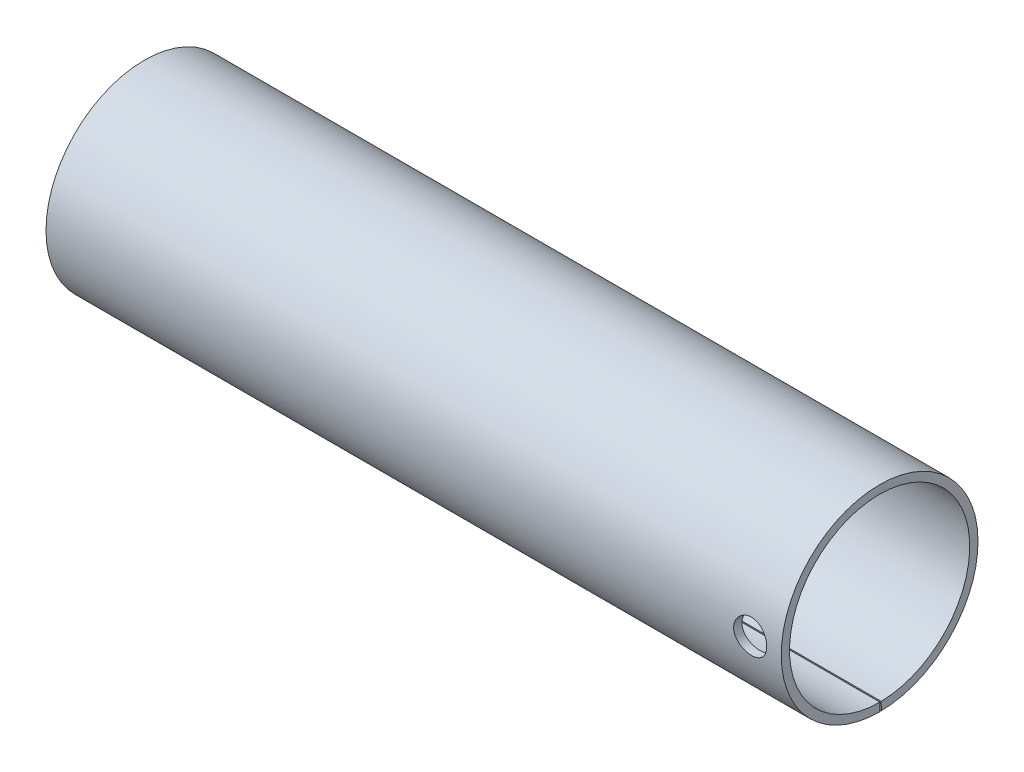
ISO-10303-21;
HEADER;
FILE_DESCRIPTION(('STEP AP214'),'2;1');
FILE_NAME('part.step','',(''),(''),'','','');
FILE_SCHEMA(('AUTOMOTIVE_DESIGN { 1 0 10303 214 1 1 1 1 }'));
ENDSEC;
DATA;
#1=APPLICATION_CONTEXT('core data for automotive mechanical design processes');
#2=APPLICATION_PROTOCOL_DEFINITION('international standard','automotive_design',2000,#1);
#3=PRODUCT_CONTEXT('',#1,'mechanical');
#4=PRODUCT('Part','Part','',(#3));
#5=PRODUCT_RELATED_PRODUCT_CATEGORY('part','',(#4));
#6=PRODUCT_DEFINITION_FORMATION('','',#4);
#7=PRODUCT_DEFINITION_CONTEXT('part definition',#1,'design');
#8=PRODUCT_DEFINITION('design','',#6,#7);
#9=PRODUCT_DEFINITION_SHAPE('','',#8);
#10=(LENGTH_UNIT() NAMED_UNIT(*) SI_UNIT(.MILLI.,.METRE.));
#11=(NAMED_UNIT(*) PLANE_ANGLE_UNIT() SI_UNIT($,.RADIAN.));
#12=(NAMED_UNIT(*) SI_UNIT($,.STERADIAN.) SOLID_ANGLE_UNIT());
#13=UNCERTAINTY_MEASURE_WITH_UNIT(LENGTH_MEASURE(1.E-05),#10,'distance_accuracy_value','');
#14=(GEOMETRIC_REPRESENTATION_CONTEXT(3) GLOBAL_UNCERTAINTY_ASSIGNED_CONTEXT((#13)) GLOBAL_UNIT_ASSIGNED_CONTEXT((#10,
#11,#12)) REPRESENTATION_CONTEXT('',''));
#15=CARTESIAN_POINT('',(0.,0.,0.));
#16=DIRECTION('',(0.,0.,1.));
#17=DIRECTION('',(1.,0.,0.));
#18=AXIS2_PLACEMENT_3D('',#15,#16,#17);
#19=CARTESIAN_POINT('',(175.5,117.75,-118.000000000001));
#20=DIRECTION('',(-1.,0.,0.));
#21=DIRECTION('',(0.,0.,-1.));
#22=AXIS2_PLACEMENT_3D('',#19,#20,#21);
#23=PLANE('',#22);
#24=DIRECTION('',(0.,1.,0.));
#25=VECTOR('',#24,1.);
#26=CARTESIAN_POINT('',(175.5,117.75,-118.100000000001));
#27=LINE('',#26,#25);
#28=CARTESIAN_POINT('',(175.5,115.75,-118.100000000001));
#29=VERTEX_POINT('',#28);
#30=CARTESIAN_POINT('',(175.5,117.75,-118.100000000001));
#31=VERTEX_POINT('',#30);
#32=EDGE_CURVE('E14',#29,#31,#27,.T.);
#33=ORIENTED_EDGE('',*,*,#32,.F.);
#34=DIRECTION('',(0.,0.,1.));
#35=VECTOR('',#34,1.);
#36=CARTESIAN_POINT('',(175.5,115.75,-118.000000000001));
#37=LINE('',#36,#35);
#38=CARTESIAN_POINT('',(175.5,115.75,-118.000000000001));
#39=VERTEX_POINT('',#38);
#40=EDGE_CURVE('E239',#39,#29,#37,.F.);
#41=ORIENTED_EDGE('',*,*,#40,.F.);
#42=DIRECTION('',(0.,1.,0.));
#43=VECTOR('',#42,1.);
#44=CARTESIAN_POINT('',(175.5,117.75,-118.000000000001));
#45=LINE('',#44,#43);
#46=CARTESIAN_POINT('',(175.5,117.75,-118.000000000001));
#47=VERTEX_POINT('',#46);
#48=EDGE_CURVE('E145',#39,#47,#45,.T.);
#49=ORIENTED_EDGE('',*,*,#48,.T.);
#50=DIRECTION('',(0.,0.,-1.));
#51=VECTOR('',#50,1.);
#52=CARTESIAN_POINT('',(175.5,117.75,-118.000000000001));
#53=LINE('',#52,#51);
#54=EDGE_CURVE('E230',#47,#31,#53,.T.);
#55=ORIENTED_EDGE('',*,*,#54,.T.);
#56=EDGE_LOOP('',(#33,#41,#49,#55));
#57=FACE_BOUND('',#56,.T.);
#58=ADVANCED_FACE('F135',(#57),#23,.T.);
#59=CARTESIAN_POINT('',(353.,117.75,-118.000000000001));
#60=DIRECTION('',(-1.,0.,0.));
#61=DIRECTION('',(0.,0.,-1.));
#62=AXIS2_PLACEMENT_3D('',#59,#60,#61);
#63=PLANE('',#62);
#64=DIRECTION('',(0.,1.,0.));
#65=VECTOR('',#64,1.);
#66=CARTESIAN_POINT('',(353.,117.75,-118.000000000001));
#67=LINE('',#66,#65);
#68=CARTESIAN_POINT('',(353.,115.75,-118.000000000001));
#69=VERTEX_POINT('',#68);
#70=CARTESIAN_POINT('',(353.,117.75,-118.000000000001));
#71=VERTEX_POINT('',#70);
#72=EDGE_CURVE('E216',#69,#71,#67,.T.);
#73=ORIENTED_EDGE('',*,*,#72,.F.);
#74=DIRECTION('',(0.,0.,1.));
#75=VECTOR('',#74,1.);
#76=CARTESIAN_POINT('',(353.,115.75,-118.000000000001));
#77=LINE('',#76,#75);
#78=CARTESIAN_POINT('',(353.,115.75,-118.100000000001));
#79=VERTEX_POINT('',#78);
#80=EDGE_CURVE('E207',#69,#79,#77,.F.);
#81=ORIENTED_EDGE('',*,*,#80,.T.);
#82=DIRECTION('',(0.,1.,0.));
#83=VECTOR('',#82,1.);
#84=CARTESIAN_POINT('',(353.,117.75,-118.100000000001));
#85=LINE('',#84,#83);
#86=CARTESIAN_POINT('',(353.,117.75,-118.100000000001));
#87=VERTEX_POINT('',#86);
#88=EDGE_CURVE('E139',#79,#87,#85,.T.);
#89=ORIENTED_EDGE('',*,*,#88,.T.);
#90=DIRECTION('',(0.,0.,-1.));
#91=VECTOR('',#90,1.);
#92=CARTESIAN_POINT('',(353.,117.75,-118.000000000001));
#93=LINE('',#92,#91);
#94=EDGE_CURVE('E224',#71,#87,#93,.T.);
#95=ORIENTED_EDGE('',*,*,#94,.F.);
#96=EDGE_LOOP('',(#73,#81,#89,#95));
#97=FACE_BOUND('',#96,.T.);
#98=ADVANCED_FACE('F252',(#97),#63,.F.);
#99=CARTESIAN_POINT('',(175.5,117.75,-118.100000000001));
#100=DIRECTION('',(0.,0.,-1.));
#101=DIRECTION('',(1.,0.,0.));
#102=AXIS2_PLACEMENT_3D('',#99,#100,#101);
#103=PLANE('',#102);
#104=DIRECTION('',(1.,0.,0.));
#105=VECTOR('',#104,1.);
#106=CARTESIAN_POINT('',(175.5,115.75,-118.100000000001));
#107=LINE('',#106,#105);
#108=EDGE_CURVE('E237',#29,#79,#107,.T.);
#109=ORIENTED_EDGE('',*,*,#108,.F.);
#110=ORIENTED_EDGE('',*,*,#32,.T.);
#111=DIRECTION('',(1.,0.,0.));
#112=VECTOR('',#111,1.);
#113=CARTESIAN_POINT('',(175.5,117.75,-118.100000000001));
#114=LINE('',#113,#112);
#115=EDGE_CURVE('E227',#31,#87,#114,.T.);
#116=ORIENTED_EDGE('',*,*,#115,.T.);
#117=ORIENTED_EDGE('',*,*,#88,.F.);
#118=EDGE_LOOP('',(#109,#110,#116,#117));
#119=FACE_BOUND('',#118,.T.);
#120=ADVANCED_FACE('F137',(#119),#103,.T.);
#121=CARTESIAN_POINT('',(175.5,117.75,-118.000000000001));
#122=DIRECTION('',(0.,-1.,0.));
#123=DIRECTION('',(1.,0.,0.));
#124=AXIS2_PLACEMENT_3D('',#121,#122,#123);
#125=PLANE('',#124);
#126=ORIENTED_EDGE('',*,*,#94,.T.);
#127=ORIENTED_EDGE('',*,*,#115,.F.);
#128=ORIENTED_EDGE('',*,*,#54,.F.);
#129=DIRECTION('',(1.,0.,0.));
#130=VECTOR('',#129,1.);
#131=CARTESIAN_POINT('',(175.5,117.75,-118.000000000001));
#132=LINE('',#131,#130);
#133=EDGE_CURVE('E232',#47,#71,#132,.T.);
#134=ORIENTED_EDGE('',*,*,#133,.T.);
#135=EDGE_LOOP('',(#126,#127,#128,#134));
#136=FACE_BOUND('',#135,.T.);
#137=ADVANCED_FACE('F247',(#136),#125,.F.);
#138=CARTESIAN_POINT('',(175.5,115.75,-118.000000000001));
#139=DIRECTION('',(0.,-1.,0.));
#140=DIRECTION('',(1.,0.,0.));
#141=AXIS2_PLACEMENT_3D('',#138,#139,#140);
#142=PLANE('',#141);
#143=ORIENTED_EDGE('',*,*,#80,.F.);
#144=DIRECTION('',(1.,0.,0.));
#145=VECTOR('',#144,1.);
#146=CARTESIAN_POINT('',(175.5,115.75,-118.000000000001));
#147=LINE('',#146,#145);
#148=EDGE_CURVE('E228',#39,#69,#147,.T.);
#149=ORIENTED_EDGE('',*,*,#148,.F.);
#150=ORIENTED_EDGE('',*,*,#40,.T.);
#151=ORIENTED_EDGE('',*,*,#108,.T.);
#152=EDGE_LOOP('',(#143,#149,#150,#151));
#153=FACE_BOUND('',#152,.T.);
#154=ADVANCED_FACE('F250',(#153),#142,.T.);
#155=CARTESIAN_POINT('',(264.250000000001,117.753312630348,-118.379589840012));
#156=DIRECTION('',(0.,0.0174524064372695,-0.999847695156391));
#157=DIRECTION('',(1.,0.,0.));
#158=AXIS2_PLACEMENT_3D('',#155,#156,#157);
#159=PLANE('',#158);
#160=DIRECTION('',(0.,-0.999847695156391,-0.0174524064372695));
#161=VECTOR('',#160,1.);
#162=CARTESIAN_POINT('',(353.,117.753312630348,-118.379589840012));
#163=LINE('',#162,#161);
#164=CARTESIAN_POINT('',(353.,117.753312630348,-118.379589840012));
#165=VERTEX_POINT('',#164);
#166=CARTESIAN_POINT('',(353.,115.753617240036,-118.414494652887));
#167=VERTEX_POINT('',#166);
#168=EDGE_CURVE('E198',#165,#167,#163,.T.);
#169=ORIENTED_EDGE('',*,*,#168,.F.);
#170=DIRECTION('',(1.,0.,0.));
#171=VECTOR('',#170,1.);
#172=CARTESIAN_POINT('',(353.,117.753312630348,-118.379589840012));
#173=LINE('',#172,#171);
#174=CARTESIAN_POINT('',(175.5,117.753312630348,-118.379589840012));
#175=VERTEX_POINT('',#174);
#176=EDGE_CURVE('E200',#175,#165,#173,.T.);
#177=ORIENTED_EDGE('',*,*,#176,.F.);
#178=DIRECTION('',(0.,-0.999847695156391,-0.0174524064372694));
#179=VECTOR('',#178,1.);
#180=CARTESIAN_POINT('',(175.5,117.753312630348,-118.379589840012));
#181=LINE('',#180,#179);
#182=CARTESIAN_POINT('',(175.5,115.753617240036,-118.414494652886));
#183=VERTEX_POINT('',#182);
#184=EDGE_CURVE('E208',#175,#183,#181,.T.);
#185=ORIENTED_EDGE('',*,*,#184,.T.);
#186=DIRECTION('',(1.,0.,0.));
#187=VECTOR('',#186,1.);
#188=CARTESIAN_POINT('',(353.,115.753617240036,-118.414494652887));
#189=LINE('',#188,#187);
#190=EDGE_CURVE('E203',#183,#167,#189,.T.);
#191=ORIENTED_EDGE('',*,*,#190,.T.);
#192=EDGE_LOOP('',(#169,#177,#185,#191));
#193=FACE_BOUND('',#192,.T.);
#194=ADVANCED_FACE('F199',(#193),#159,.F.);
#195=CARTESIAN_POINT('',(175.5,139.500000000017,-118.000000000001));
#196=DIRECTION('',(-1.,0.,0.));
#197=DIRECTION('',(0.,0.,1.));
#198=AXIS2_PLACEMENT_3D('',#195,#196,#197);
#199=PLANE('',#198);
#200=ORIENTED_EDGE('',*,*,#184,.F.);
#201=CARTESIAN_POINT('',(175.5,139.500000000017,-118.000000000001));
#202=DIRECTION('',(1.,0.,0.));
#203=DIRECTION('',(0.,0.,-1.));
#204=AXIS2_PLACEMENT_3D('',#201,#202,#203);
#205=CIRCLE('',#204,21.750000000017);
#206=EDGE_CURVE('E211',#47,#175,#205,.F.);
#207=ORIENTED_EDGE('',*,*,#206,.F.);
#208=ORIENTED_EDGE('',*,*,#48,.F.);
#209=CARTESIAN_POINT('',(175.5,139.500000000017,-118.000000000001));
#210=DIRECTION('',(1.,0.,0.));
#211=DIRECTION('',(0.,0.,-1.));
#212=AXIS2_PLACEMENT_3D('',#209,#210,#211);
#213=CIRCLE('',#212,23.750000000017);
#214=EDGE_CURVE('E222',#39,#183,#213,.F.);
#215=ORIENTED_EDGE('',*,*,#214,.T.);
#216=EDGE_LOOP('',(#200,#207,#208,#215));
#217=FACE_BOUND('',#216,.T.);
#218=ADVANCED_FACE('F267',(#217),#199,.T.);
#219=CARTESIAN_POINT('',(353.,139.500000000017,-118.000000000001));
#220=DIRECTION('',(-1.,0.,0.));
#221=DIRECTION('',(0.,0.,1.));
#222=AXIS2_PLACEMENT_3D('',#219,#220,#221);
#223=PLANE('',#222);
#224=CARTESIAN_POINT('',(353.,139.500000000017,-118.000000000001));
#225=DIRECTION('',(1.,0.,0.));
#226=DIRECTION('',(0.,0.,-1.));
#227=AXIS2_PLACEMENT_3D('',#224,#225,#226);
#228=CIRCLE('',#227,21.750000000017);
#229=EDGE_CURVE('E153',#165,#71,#228,.T.);
#230=ORIENTED_EDGE('',*,*,#229,.F.);
#231=ORIENTED_EDGE('',*,*,#168,.T.);
#232=CARTESIAN_POINT('',(353.,139.500000000017,-118.000000000001));
#233=DIRECTION('',(1.,0.,0.));
#234=DIRECTION('',(0.,0.,-1.));
#235=AXIS2_PLACEMENT_3D('',#232,#233,#234);
#236=CIRCLE('',#235,23.750000000017);
#237=EDGE_CURVE('E305',#167,#69,#236,.T.);
#238=ORIENTED_EDGE('',*,*,#237,.T.);
#239=ORIENTED_EDGE('',*,*,#72,.T.);
#240=EDGE_LOOP('',(#230,#231,#238,#239));
#241=FACE_BOUND('',#240,.T.);
#242=ADVANCED_FACE('F214',(#241),#223,.F.);
#243=CARTESIAN_POINT('',(353.,139.500000000017,-118.000000000001));
#244=DIRECTION('',(1.,0.,0.));
#245=DIRECTION('',(0.,-0.999847695156391,-0.0174524064372695));
#246=AXIS2_PLACEMENT_3D('',#243,#244,#245);
#247=CYLINDRICAL_SURFACE('',#246,23.750000000017);
#248=CARTESIAN_POINT('',(345.5,135.5,-94.5892652827678));
#249=CARTESIAN_POINT('',(345.722965487352,135.500008931218,-94.5892612296423));
#250=CARTESIAN_POINT('',(345.946051873762,135.518705747215,-94.5860454482442));
#251=CARTESIAN_POINT('',(346.385962754968,135.592965078797,-94.573541842802));
#252=CARTESIAN_POINT('',(346.602781321866,135.648561374315,-94.5642484550775));
#253=CARTESIAN_POINT('',(347.02372652066,135.794888049544,-94.5406713823614));
#254=CARTESIAN_POINT('',(347.227863688412,135.88558879847,-94.5263919069925));
#255=CARTESIAN_POINT('',(347.618001312265,136.0994755358,-94.4944565720759));
#256=CARTESIAN_POINT('',(347.804003755937,136.222657958707,-94.4768010831699));
#257=CARTESIAN_POINT('',(348.154485311411,136.499333589979,-94.4399045283923));
#258=CARTESIAN_POINT('',(348.318755447936,136.653089842502,-94.4206506122758));
#259=CARTESIAN_POINT('',(348.619293802098,136.985980097835,-94.3828407359081));
#260=CARTESIAN_POINT('',(348.755560346332,137.165115616146,-94.364284817421));
#261=CARTESIAN_POINT('',(348.997009061645,137.545034948175,-94.3298255653634));
#262=CARTESIAN_POINT('',(349.101996537103,137.745944157083,-94.3139391039467));
#263=CARTESIAN_POINT('',(349.276655240418,138.16285899586,-94.2867518074853));
#264=CARTESIAN_POINT('',(349.346328812714,138.378863622483,-94.2754506680376));
#265=CARTESIAN_POINT('',(349.447742204126,138.817678162669,-94.2587980665008));
#266=CARTESIAN_POINT('',(349.479833241979,139.040404783545,-94.253391551034));
#267=CARTESIAN_POINT('',(349.506262935785,139.488142312714,-94.2489481680086));
#268=CARTESIAN_POINT('',(349.500604209671,139.713153061521,-94.2499108587477));
#269=CARTESIAN_POINT('',(349.451968545668,140.15666966275,-94.2580538828586));
#270=CARTESIAN_POINT('',(349.409369602916,140.37521828762,-94.2651712358661));
#271=CARTESIAN_POINT('',(349.28865815031,140.802020493697,-94.2847536187771));
#272=CARTESIAN_POINT('',(349.210544540989,141.010273755957,-94.2972188142391));
#273=CARTESIAN_POINT('',(349.020646699653,141.411695609876,-94.3262033550515));
#274=CARTESIAN_POINT('',(348.908707085809,141.604789295202,-94.3427413427329));
#275=CARTESIAN_POINT('',(348.654448680134,141.969594422132,-94.3780347461896));
#276=CARTESIAN_POINT('',(348.512127378815,142.141304095587,-94.3967903450796));
#277=CARTESIAN_POINT('',(348.199050136528,142.460700800474,-94.4347080212873));
#278=CARTESIAN_POINT('',(348.027963796849,142.608063898193,-94.453872255798));
#279=CARTESIAN_POINT('',(347.663325216722,142.872044695894,-94.4902227731135));
#280=CARTESIAN_POINT('',(347.469772760473,142.988662100509,-94.5074090369155));
#281=CARTESIAN_POINT('',(347.065316213769,143.18790713546,-94.5378589956075));
#282=CARTESIAN_POINT('',(346.854392225591,143.270495119375,-94.5511181100949));
#283=CARTESIAN_POINT('',(346.421391692759,143.398977323948,-94.5721372019082));
#284=CARTESIAN_POINT('',(346.199316154124,143.444874848274,-94.5798976743335));
#285=CARTESIAN_POINT('',(345.753216587668,143.498215790851,-94.5889448451825));
#286=CARTESIAN_POINT('',(345.529249336106,143.506121269282,-94.5903093267464));
#287=CARTESIAN_POINT('',(345.083192063446,143.484485612019,-94.5866172819841));
#288=CARTESIAN_POINT('',(344.861101968585,143.454945954649,-94.5815610091478));
#289=CARTESIAN_POINT('',(344.426575186857,143.359652721506,-94.5656690826624));
#290=CARTESIAN_POINT('',(344.214085299562,143.294134901062,-94.5548710675608));
#291=CARTESIAN_POINT('',(343.803101011004,143.128992640283,-94.5287439740286));
#292=CARTESIAN_POINT('',(343.604607463772,143.029366120871,-94.5134146194007));
#293=CARTESIAN_POINT('',(343.225195588188,142.797746135395,-94.4797716353204));
#294=CARTESIAN_POINT('',(343.044460227834,142.665456905281,-94.4614312800938));
#295=CARTESIAN_POINT('',(342.707587945635,142.372672078717,-94.4239107205847));
#296=CARTESIAN_POINT('',(342.551452793547,142.212174454692,-94.4047304560053));
#297=CARTESIAN_POINT('',(342.266522656668,141.865480314987,-94.3674448620473));
#298=CARTESIAN_POINT('',(342.138036027743,141.679028692512,-94.3493531307527));
#299=CARTESIAN_POINT('',(341.914211374316,141.286918084513,-94.3165020456195));
#300=CARTESIAN_POINT('',(341.818872260126,141.081259730672,-94.3017425822418));
#301=CARTESIAN_POINT('',(341.664527357094,140.65748445959,-94.2772780782731));
#302=CARTESIAN_POINT('',(341.605361004752,140.439427364939,-94.2675507312039));
#303=CARTESIAN_POINT('',(341.524524470029,139.996294530672,-94.2541520936568));
#304=CARTESIAN_POINT('',(341.502851134245,139.771219382941,-94.25048029387));
#305=CARTESIAN_POINT('',(341.497708128307,139.323414160446,-94.2496138961314));
#306=CARTESIAN_POINT('',(341.513769566599,139.100689485671,-94.2523398000104));
#307=CARTESIAN_POINT('',(341.582624972301,138.661158376945,-94.2638000021339));
#308=CARTESIAN_POINT('',(341.635418723321,138.444351908138,-94.2725342649834));
#309=CARTESIAN_POINT('',(341.776058751039,138.022996135831,-94.2950330118361));
#310=CARTESIAN_POINT('',(341.863864349113,137.818432923581,-94.3087916566896));
#311=CARTESIAN_POINT('',(342.071983082655,137.426870218683,-94.3398382308063));
#312=CARTESIAN_POINT('',(342.19229781167,137.239871587628,-94.3571263330678));
#313=CARTESIAN_POINT('',(342.4636779383,136.886386212975,-94.3935705781584));
#314=CARTESIAN_POINT('',(342.615086342272,136.720164783602,-94.412746194431));
#315=CARTESIAN_POINT('',(342.943636614926,136.415322948153,-94.4506703921584));
#316=CARTESIAN_POINT('',(343.120784502979,136.276709016323,-94.4694188725345));
#317=CARTESIAN_POINT('',(343.497309383233,136.030092823139,-94.504512826039));
#318=CARTESIAN_POINT('',(343.696838047748,135.922319488051,-94.5208399160237));
#319=CARTESIAN_POINT('',(344.111362310178,135.741985916346,-94.5490249398124));
#320=CARTESIAN_POINT('',(344.326342278345,135.669390655394,-94.5608873161786));
#321=CARTESIAN_POINT('',(344.701786680651,135.577159779213,-94.5761815023287));
#322=CARTESIAN_POINT('',(344.859983426029,135.548271533844,-94.5810604926226));
#323=CARTESIAN_POINT('',(345.178765890058,135.509688607108,-94.5876038127864));
#324=CARTESIAN_POINT('',(345.33935156375,135.499993564986,-94.5892682030775));
#325=CARTESIAN_POINT('',(345.5,135.5,-94.5892652827678));
#326=B_SPLINE_CURVE_WITH_KNOTS('',3,(#248,#249,#250,#251,#252,#253,#254,#255,#256,#257,#258,
#259,#260,#261,#262,#263,#264,#265,#266,#267,#268,#269,#270,#271,#272,#273,#274,#275,#276,#277,
#278,#279,#280,#281,#282,#283,#284,#285,#286,#287,#288,#289,#290,#291,#292,#293,#294,#295,#296,
#297,#298,#299,#300,#301,#302,#303,#304,#305,#306,#307,#308,#309,#310,#311,#312,#313,#314,#315,
#316,#317,#318,#319,#320,#321,#322,#323,#324,#325),.UNSPECIFIED.,.T.,.F.,(4,2,2,2,2,2,2,2,2,2,2,
2,2,2,2,2,2,2,2,2,2,2,2,2,2,2,2,2,2,2,2,2,2,2,2,2,2,2,4),(0.,0.66830896564751,1.33723058569117,
2.00558881289027,2.67387370528122,3.34817851097145,4.02252359920856,4.70098240803874,
5.37939616906734,6.05141806157621,6.72339335007365,7.38857264140578,8.05377252684295,
8.72207573735492,9.39043417021766,10.0670719961557,10.7437163221297,11.4211467674002,
12.0985162088774,12.7676262522299,13.4367098801137,14.101460611223,14.7662518690543,
15.4372990921252,16.1083945687605,16.7866256967898,17.4648345266229,18.1400106448353,
18.8151299736727,19.4819047330879,20.1486755645729,20.8146739531263,21.4807049938164,
22.1545212885092,22.8284954145921,23.5073497737627,24.1855268495367,24.6670579132698,
25.1485799261048),.UNSPECIFIED.);
#327=CARTESIAN_POINT('',(345.5,135.5,-94.5892652827678));
#328=VERTEX_POINT('',#327);
#329=EDGE_CURVE('E212',#328,#328,#326,.T.);
#330=ORIENTED_EDGE('',*,*,#329,.F.);
#331=EDGE_LOOP('',(#330));
#332=FACE_BOUND('',#331,.T.);
#333=ORIENTED_EDGE('',*,*,#148,.T.);
#334=ORIENTED_EDGE('',*,*,#237,.F.);
#335=ORIENTED_EDGE('',*,*,#190,.F.);
#336=ORIENTED_EDGE('',*,*,#214,.F.);
#337=EDGE_LOOP('',(#333,#334,#335,#336));
#338=FACE_BOUND('',#337,.T.);
#339=ADVANCED_FACE('F266',(#332,#338),#247,.T.);
#340=CARTESIAN_POINT('',(353.,139.500000000017,-118.000000000001));
#341=DIRECTION('',(1.,0.,0.));
#342=DIRECTION('',(0.,-0.999847695156391,-0.0174524064372695));
#343=AXIS2_PLACEMENT_3D('',#340,#341,#342);
#344=CYLINDRICAL_SURFACE('',#343,21.750000000017);
#345=CARTESIAN_POINT('',(345.5,135.500000000002,-96.6209799101884));
#346=CARTESIAN_POINT('',(345.722633744496,135.500008618884,-96.6209756436992));
#347=CARTESIAN_POINT('',(345.94538023811,135.518650211391,-96.6174645123838));
#348=CARTESIAN_POINT('',(346.384597922237,135.592677009972,-96.603815991813));
#349=CARTESIAN_POINT('',(346.60106353793,135.648093875176,-96.5936728933346));
#350=CARTESIAN_POINT('',(347.021300578274,135.793916544075,-96.5679471937062));
#351=CARTESIAN_POINT('',(347.225083410559,135.884290361594,-96.5523695665121));
#352=CARTESIAN_POINT('',(347.614580201866,136.097377689757,-96.5175358997405));
#353=CARTESIAN_POINT('',(347.800295680732,136.220088476958,-96.4982801699731));
#354=CARTESIAN_POINT('',(348.15062567101,136.495933216693,-96.458002312785));
#355=CARTESIAN_POINT('',(348.314992366215,136.649379504855,-96.4369634477599));
#356=CARTESIAN_POINT('',(348.615801062413,136.98166442274,-96.395637850047));
#357=CARTESIAN_POINT('',(348.752241263278,137.16050468809,-96.3753511659132));
#358=CARTESIAN_POINT('',(348.994270133907,137.540124829549,-96.3376367570232));
#359=CARTESIAN_POINT('',(349.09962567949,137.74105570926,-96.3202310449548));
#360=CARTESIAN_POINT('',(349.274993277219,138.158138710731,-96.2904268906922));
#361=CARTESIAN_POINT('',(349.345008124794,138.374289627051,-96.2780280524727));
#362=CARTESIAN_POINT('',(349.44694201872,138.813110198704,-96.2597528695979));
#363=CARTESIAN_POINT('',(349.47927860241,139.035679839946,-96.2538050886695));
#364=CARTESIAN_POINT('',(349.506238563061,139.483159478681,-96.2488560915254));
#365=CARTESIAN_POINT('',(349.500865034634,139.708069282621,-96.2498543052996));
#366=CARTESIAN_POINT('',(349.45287850216,140.15098301074,-96.2586288703138));
#367=CARTESIAN_POINT('',(349.410715039165,140.369037494301,-96.2663233954814));
#368=CARTESIAN_POINT('',(349.291055926336,140.794922763049,-96.2875343590276));
#369=CARTESIAN_POINT('',(349.213559025313,141.002753185903,-96.3010510035715));
#370=CARTESIAN_POINT('',(349.025001253532,141.403600668862,-96.3325247135247));
#371=CARTESIAN_POINT('',(348.91375968535,141.596530783573,-96.3505055876741));
#372=CARTESIAN_POINT('',(348.661003319611,141.961154092614,-96.3889175715533));
#373=CARTESIAN_POINT('',(348.519485556008,142.132845203636,-96.4093489212607));
#374=CARTESIAN_POINT('',(348.207713794797,142.452779036136,-96.4507529689238));
#375=CARTESIAN_POINT('',(348.037066566847,142.600638354738,-96.4717292062702));
#376=CARTESIAN_POINT('',(347.673192536115,142.865694391341,-96.511570073509));
#377=CARTESIAN_POINT('',(347.479965427291,142.982890693672,-96.5304346747738));
#378=CARTESIAN_POINT('',(347.075919846085,143.18339705014,-96.563920939361));
#379=CARTESIAN_POINT('',(346.865073985491,143.266653117642,-96.5785358324316));
#380=CARTESIAN_POINT('',(346.432058183365,143.396452245176,-96.6017629039461));
#381=CARTESIAN_POINT('',(346.209889475354,143.442999295259,-96.6103757347666));
#382=CARTESIAN_POINT('',(345.76398700121,143.497502910842,-96.6204949241347));
#383=CARTESIAN_POINT('',(345.540322700075,143.506009533996,-96.622102567631));
#384=CARTESIAN_POINT('',(345.094769061886,143.485663756265,-96.6183001684762));
#385=CARTESIAN_POINT('',(344.872879641065,143.456813129088,-96.6128904590066));
#386=CARTESIAN_POINT('',(344.438971674737,143.363043454145,-96.5957571001383));
#387=CARTESIAN_POINT('',(344.226888979532,143.298411250208,-96.5840836864858));
#388=CARTESIAN_POINT('',(343.816563389099,143.135216807799,-96.5557812932579));
#389=CARTESIAN_POINT('',(343.618321481204,143.036652151724,-96.5391519605969));
#390=CARTESIAN_POINT('',(343.238877080476,142.807118905375,-96.5025799381901));
#391=CARTESIAN_POINT('',(343.057888750485,142.675801930372,-96.4826024367302));
#392=CARTESIAN_POINT('',(342.720317572162,142.384962938239,-96.4416836490051));
#393=CARTESIAN_POINT('',(342.563736833441,142.225438485603,-96.4207422796327));
#394=CARTESIAN_POINT('',(342.277378974239,141.88025965197,-96.3799307588683));
#395=CARTESIAN_POINT('',(342.147971236669,141.694296484848,-96.3600777836173));
#396=CARTESIAN_POINT('',(341.922236178921,141.302949409212,-96.3239664346558));
#397=CARTESIAN_POINT('',(341.825907619544,141.09756622857,-96.3077079262989));
#398=CARTESIAN_POINT('',(341.669622260376,140.674243577587,-96.2806914122827));
#399=CARTESIAN_POINT('',(341.609481925062,140.456373712051,-96.2699056947808));
#400=CARTESIAN_POINT('',(341.526693414834,140.013409169009,-96.2549319904357));
#401=CARTESIAN_POINT('',(341.504041451254,139.788315223931,-96.2507433368792));
#402=CARTESIAN_POINT('',(341.497000483074,139.340838538526,-96.2494482735978));
#403=CARTESIAN_POINT('',(341.512052855007,139.118464693614,-96.2522384651388));
#404=CARTESIAN_POINT('',(341.578772543151,138.679471615227,-96.2643734092004));
#405=CARTESIAN_POINT('',(341.630439536629,138.462852331048,-96.273718103948));
#406=CARTESIAN_POINT('',(341.768690118831,138.04179797115,-96.2979129435505));
#407=CARTESIAN_POINT('',(341.855216382542,137.837343521184,-96.31275404651));
#408=CARTESIAN_POINT('',(342.060663306362,137.445770763721,-96.3463327120101));
#409=CARTESIAN_POINT('',(342.179586025713,137.258653559259,-96.3650705222224));
#410=CARTESIAN_POINT('',(342.448383413048,136.904277511763,-96.4046996444998));
#411=CARTESIAN_POINT('',(342.598662697561,136.737328463829,-96.4256171139888));
#412=CARTESIAN_POINT('',(342.92506572415,136.430823664167,-96.4670801354253));
#413=CARTESIAN_POINT('',(343.101195528475,136.291274355993,-96.4876255988599));
#414=CARTESIAN_POINT('',(343.4761619891,136.042374500371,-96.5262165766364));
#415=CARTESIAN_POINT('',(343.675185734733,135.933302022769,-96.5442383676909));
#416=CARTESIAN_POINT('',(344.088996529358,135.750313369696,-96.5754571076331));
#417=CARTESIAN_POINT('',(344.303768313903,135.676363656703,-96.5886586564074));
#418=CARTESIAN_POINT('',(344.682677088986,135.580936621806,-96.605957575213));
#419=CARTESIAN_POINT('',(344.844581056688,135.550636794244,-96.6115578885153));
#420=CARTESIAN_POINT('',(345.170969530247,135.510165554032,-96.6190705858014));
#421=CARTESIAN_POINT('',(345.335453970422,135.499993629886,-96.6209830635013));
#422=CARTESIAN_POINT('',(345.5,135.500000000002,-96.6209799101884));
#423=B_SPLINE_CURVE_WITH_KNOTS('',3,(#345,#346,#347,#348,#349,#350,#351,#352,#353,#354,#355,
#356,#357,#358,#359,#360,#361,#362,#363,#364,#365,#366,#367,#368,#369,#370,#371,#372,#373,#374,
#375,#376,#377,#378,#379,#380,#381,#382,#383,#384,#385,#386,#387,#388,#389,#390,#391,#392,#393,
#394,#395,#396,#397,#398,#399,#400,#401,#402,#403,#404,#405,#406,#407,#408,#409,#410,#411,#412,
#413,#414,#415,#416,#417,#418,#419,#420,#421,#422),.UNSPECIFIED.,.T.,.F.,(4,2,2,2,2,2,2,2,2,2,2,
2,2,2,2,2,2,2,2,2,2,2,2,2,2,2,2,2,2,2,2,2,2,2,2,2,2,2,4),(0.,0.667299157809677,1.33517352725845,
2.00243822102811,2.66964673522541,3.34401495171849,4.01842662398315,4.69777458277679,
5.37706879710174,6.04876148026069,6.72039904284454,7.38394292129549,8.04751029825062,
8.71469565143859,9.38194639623439,10.0590434322441,10.7361496465557,11.4143287285031,
12.0924340862614,12.7607017787496,13.4289377432758,14.0918927640142,14.7548950284376,
15.4252751654758,16.0957132131238,16.7747468444634,17.4537550353512,18.1292898261337,
18.8047563415568,19.4702745837473,20.1357869599476,20.8002093595881,21.4646740023065,
22.1383113136872,22.8121068540417,23.4918630297576,24.1709688181787,24.6641744533523,
25.1573675549033),.UNSPECIFIED.);
#424=CARTESIAN_POINT('',(345.5,135.500000000002,-96.6209799101884));
#425=VERTEX_POINT('',#424);
#426=EDGE_CURVE('E289',#425,#425,#423,.T.);
#427=ORIENTED_EDGE('',*,*,#426,.T.);
#428=EDGE_LOOP('',(#427));
#429=FACE_BOUND('',#428,.T.);
#430=ORIENTED_EDGE('',*,*,#133,.F.);
#431=ORIENTED_EDGE('',*,*,#206,.T.);
#432=ORIENTED_EDGE('',*,*,#176,.T.);
#433=ORIENTED_EDGE('',*,*,#229,.T.);
#434=EDGE_LOOP('',(#430,#431,#432,#433));
#435=FACE_BOUND('',#434,.T.);
#436=ADVANCED_FACE('F210',(#429,#435),#344,.F.);
#437=CARTESIAN_POINT('',(345.5,139.5,-94.2499999999842));
#438=DIRECTION('',(0.,-7.04699456682621E-13,1.));
#439=DIRECTION('',(0.,-1.,-7.04699456682621E-13));
#440=AXIS2_PLACEMENT_3D('',#437,#438,#439);
#441=CYLINDRICAL_SURFACE('',#440,4.);
#442=ORIENTED_EDGE('',*,*,#329,.T.);
#443=EDGE_LOOP('',(#442));
#444=FACE_BOUND('',#443,.T.);
#445=ORIENTED_EDGE('',*,*,#426,.F.);
#446=EDGE_LOOP('',(#445));
#447=FACE_BOUND('',#446,.T.);
#448=ADVANCED_FACE('F274',(#444,#447),#441,.F.);
#449=CLOSED_SHELL('',(#58,#98,#120,#137,#154,#194,#218,#242,#339,#436,#448));
#450=MANIFOLD_SOLID_BREP('B2',#449);
#451=ADVANCED_BREP_SHAPE_REPRESENTATION('',(#18,#450),#14);
#452=SHAPE_DEFINITION_REPRESENTATION(#9,#451);
ENDSEC;
END-ISO-10303-21;
